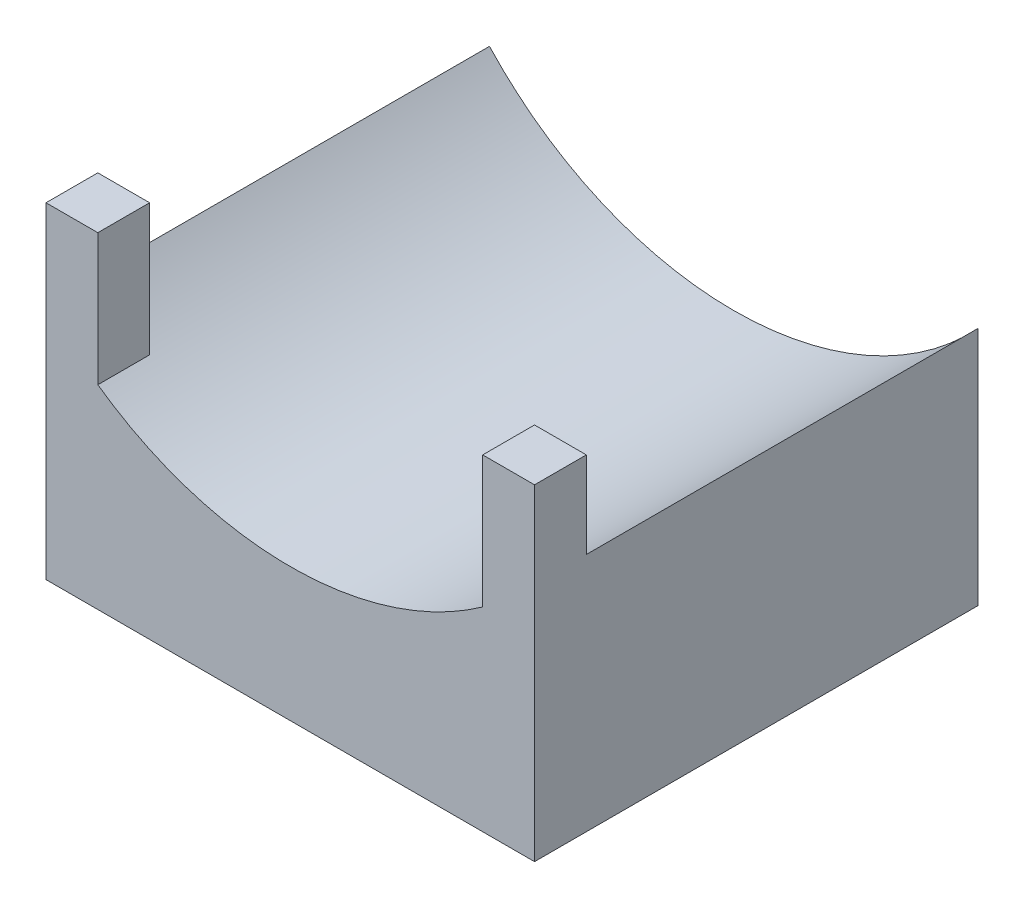
ISO-10303-21;
HEADER;
FILE_DESCRIPTION(('STEP AP214'),'2;1');
FILE_NAME('part.step','',(''),(''),'','','');
FILE_SCHEMA(('AUTOMOTIVE_DESIGN { 1 0 10303 214 1 1 1 1 }'));
ENDSEC;
DATA;
#1=APPLICATION_CONTEXT('core data for automotive mechanical design processes');
#2=APPLICATION_PROTOCOL_DEFINITION('international standard','automotive_design',2000,#1);
#3=PRODUCT_CONTEXT('',#1,'mechanical');
#4=PRODUCT('Part','Part','',(#3));
#5=PRODUCT_RELATED_PRODUCT_CATEGORY('part','',(#4));
#6=PRODUCT_DEFINITION_FORMATION('','',#4);
#7=PRODUCT_DEFINITION_CONTEXT('part definition',#1,'design');
#8=PRODUCT_DEFINITION('design','',#6,#7);
#9=PRODUCT_DEFINITION_SHAPE('','',#8);
#10=(LENGTH_UNIT() NAMED_UNIT(*) SI_UNIT(.MILLI.,.METRE.));
#11=(NAMED_UNIT(*) PLANE_ANGLE_UNIT() SI_UNIT($,.RADIAN.));
#12=(NAMED_UNIT(*) SI_UNIT($,.STERADIAN.) SOLID_ANGLE_UNIT());
#13=UNCERTAINTY_MEASURE_WITH_UNIT(LENGTH_MEASURE(1.E-05),#10,'distance_accuracy_value','');
#14=(GEOMETRIC_REPRESENTATION_CONTEXT(3) GLOBAL_UNCERTAINTY_ASSIGNED_CONTEXT((#13)) GLOBAL_UNIT_ASSIGNED_CONTEXT((#10,
#11,#12)) REPRESENTATION_CONTEXT('',''));
#15=CARTESIAN_POINT('',(0.,0.,0.));
#16=DIRECTION('',(0.,0.,1.));
#17=DIRECTION('',(1.,0.,0.));
#18=AXIS2_PLACEMENT_3D('',#15,#16,#17);
#19=CARTESIAN_POINT('',(-5.8962,-14.2875,13.5875));
#20=DIRECTION('',(-1.,0.,0.));
#21=DIRECTION('',(0.,0.,1.));
#22=AXIS2_PLACEMENT_3D('',#19,#20,#21);
#23=PLANE('',#22);
#24=DIRECTION('',(0.,0.,-1.));
#25=VECTOR('',#24,1.);
#26=CARTESIAN_POINT('',(-5.8962,-8.32314997822339,13.5875));
#27=LINE('',#26,#25);
#28=CARTESIAN_POINT('',(-5.8962,-8.32314997822339,13.5875));
#29=VERTEX_POINT('',#28);
#30=CARTESIAN_POINT('',(-5.8962,-8.32314997822339,12.));
#31=VERTEX_POINT('',#30);
#32=EDGE_CURVE('E186',#29,#31,#27,.T.);
#33=ORIENTED_EDGE('',*,*,#32,.T.);
#34=DIRECTION('',(0.,1.,0.));
#35=VECTOR('',#34,1.);
#36=CARTESIAN_POINT('',(-5.8962,-14.2875,12.));
#37=LINE('',#36,#35);
#38=CARTESIAN_POINT('',(-5.8962,-4.2875,12.));
#39=VERTEX_POINT('',#38);
#40=EDGE_CURVE('E150',#31,#39,#37,.T.);
#41=ORIENTED_EDGE('',*,*,#40,.T.);
#42=DIRECTION('',(0.,0.,-1.));
#43=VECTOR('',#42,1.);
#44=CARTESIAN_POINT('',(-5.8962,-4.2875,13.5875));
#45=LINE('',#44,#43);
#46=CARTESIAN_POINT('',(-5.8962,-4.2875,13.5875));
#47=VERTEX_POINT('',#46);
#48=EDGE_CURVE('E105',#47,#39,#45,.T.);
#49=ORIENTED_EDGE('',*,*,#48,.F.);
#50=DIRECTION('',(0.,1.,0.));
#51=VECTOR('',#50,1.);
#52=CARTESIAN_POINT('',(-5.8962,-14.2875,13.5875));
#53=LINE('',#52,#51);
#54=EDGE_CURVE('E211',#29,#47,#53,.T.);
#55=ORIENTED_EDGE('',*,*,#54,.F.);
#56=EDGE_LOOP('',(#33,#41,#49,#55));
#57=FACE_BOUND('',#56,.T.);
#58=ADVANCED_FACE('F45',(#57),#23,.F.);
#59=CARTESIAN_POINT('',(5.8962,-14.2875,13.5875));
#60=DIRECTION('',(1.,0.,0.));
#61=DIRECTION('',(0.,0.,-1.));
#62=AXIS2_PLACEMENT_3D('',#59,#60,#61);
#63=PLANE('',#62);
#64=DIRECTION('',(0.,0.,-1.));
#65=VECTOR('',#64,1.);
#66=CARTESIAN_POINT('',(5.8962,-8.32314997822339,13.5875));
#67=LINE('',#66,#65);
#68=CARTESIAN_POINT('',(5.8962,-8.32314997822339,13.5875));
#69=VERTEX_POINT('',#68);
#70=CARTESIAN_POINT('',(5.8962,-8.32314997822339,12.));
#71=VERTEX_POINT('',#70);
#72=EDGE_CURVE('E191',#69,#71,#67,.T.);
#73=ORIENTED_EDGE('',*,*,#72,.F.);
#74=DIRECTION('',(0.,-1.,0.));
#75=VECTOR('',#74,1.);
#76=CARTESIAN_POINT('',(5.8962,-14.2875,13.5875));
#77=LINE('',#76,#75);
#78=CARTESIAN_POINT('',(5.8962,-4.2875,13.5875));
#79=VERTEX_POINT('',#78);
#80=EDGE_CURVE('E179',#79,#69,#77,.T.);
#81=ORIENTED_EDGE('',*,*,#80,.F.);
#82=DIRECTION('',(0.,0.,-1.));
#83=VECTOR('',#82,1.);
#84=CARTESIAN_POINT('',(5.8962,-4.2875,13.5875));
#85=LINE('',#84,#83);
#86=CARTESIAN_POINT('',(5.8962,-4.2875,12.));
#87=VERTEX_POINT('',#86);
#88=EDGE_CURVE('E175',#79,#87,#85,.T.);
#89=ORIENTED_EDGE('',*,*,#88,.T.);
#90=DIRECTION('',(0.,-1.,0.));
#91=VECTOR('',#90,1.);
#92=CARTESIAN_POINT('',(5.8962,-14.2875,12.));
#93=LINE('',#92,#91);
#94=EDGE_CURVE('E183',#87,#71,#93,.T.);
#95=ORIENTED_EDGE('',*,*,#94,.T.);
#96=EDGE_LOOP('',(#73,#81,#89,#95));
#97=FACE_BOUND('',#96,.T.);
#98=ADVANCED_FACE('F255',(#97),#63,.F.);
#99=CARTESIAN_POINT('',(0.,0.,12.));
#100=DIRECTION('',(0.,0.,-1.));
#101=DIRECTION('',(-1.,0.,0.));
#102=AXIS2_PLACEMENT_3D('',#99,#100,#101);
#103=CYLINDRICAL_SURFACE('',#102,10.2);
#104=CARTESIAN_POINT('',(0.,0.,0.));
#105=DIRECTION('',(0.,0.,1.));
#106=DIRECTION('',(1.,0.,0.));
#107=AXIS2_PLACEMENT_3D('',#104,#105,#106);
#108=CIRCLE('',#107,10.2);
#109=CARTESIAN_POINT('',(-7.4837,-6.93067343841852,0.));
#110=VERTEX_POINT('',#109);
#111=CARTESIAN_POINT('',(7.4837,-6.93067343841852,0.));
#112=VERTEX_POINT('',#111);
#113=EDGE_CURVE('E86',#110,#112,#108,.T.);
#114=ORIENTED_EDGE('',*,*,#113,.F.);
#115=DIRECTION('',(0.,0.,-1.));
#116=VECTOR('',#115,1.);
#117=CARTESIAN_POINT('',(-7.4837,-6.93067343841852,12.));
#118=LINE('',#117,#116);
#119=CARTESIAN_POINT('',(-7.4837,-6.93067343841852,12.));
#120=VERTEX_POINT('',#119);
#121=EDGE_CURVE('E11',#120,#110,#118,.T.);
#122=ORIENTED_EDGE('',*,*,#121,.F.);
#123=CARTESIAN_POINT('',(0.,0.,12.));
#124=DIRECTION('',(0.,0.,1.));
#125=DIRECTION('',(1.,0.,0.));
#126=AXIS2_PLACEMENT_3D('',#123,#124,#125);
#127=CIRCLE('',#126,10.2);
#128=EDGE_CURVE('E92',#120,#31,#127,.T.);
#129=ORIENTED_EDGE('',*,*,#128,.T.);
#130=ORIENTED_EDGE('',*,*,#32,.F.);
#131=CARTESIAN_POINT('',(0.,0.,13.5875));
#132=DIRECTION('',(0.,0.,-1.));
#133=DIRECTION('',(1.,0.,0.));
#134=AXIS2_PLACEMENT_3D('',#131,#132,#133);
#135=CIRCLE('',#134,10.2);
#136=EDGE_CURVE('E246',#69,#29,#135,.T.);
#137=ORIENTED_EDGE('',*,*,#136,.F.);
#138=ORIENTED_EDGE('',*,*,#72,.T.);
#139=CARTESIAN_POINT('',(7.4837,-6.93067343841852,12.));
#140=VERTEX_POINT('',#139);
#141=EDGE_CURVE('E63',#71,#140,#127,.T.);
#142=ORIENTED_EDGE('',*,*,#141,.T.);
#143=DIRECTION('',(0.,0.,-1.));
#144=VECTOR('',#143,1.);
#145=CARTESIAN_POINT('',(7.4837,-6.93067343841852,12.));
#146=LINE('',#145,#144);
#147=EDGE_CURVE('E83',#140,#112,#146,.T.);
#148=ORIENTED_EDGE('',*,*,#147,.T.);
#149=EDGE_LOOP('',(#114,#122,#129,#130,#137,#138,#142,#148));
#150=FACE_BOUND('',#149,.T.);
#151=ADVANCED_FACE('F47',(#150),#103,.F.);
#152=CARTESIAN_POINT('',(-7.4837,0.,12.));
#153=DIRECTION('',(1.,0.,0.));
#154=DIRECTION('',(0.,1.,0.));
#155=AXIS2_PLACEMENT_3D('',#152,#153,#154);
#156=PLANE('',#155);
#157=DIRECTION('',(0.,-1.,0.));
#158=VECTOR('',#157,1.);
#159=CARTESIAN_POINT('',(-7.4837,0.,0.));
#160=LINE('',#159,#158);
#161=CARTESIAN_POINT('',(-7.4837,-14.2875,0.));
#162=VERTEX_POINT('',#161);
#163=EDGE_CURVE('E103',#110,#162,#160,.T.);
#164=ORIENTED_EDGE('',*,*,#163,.T.);
#165=DIRECTION('',(0.,0.,-1.));
#166=VECTOR('',#165,1.);
#167=CARTESIAN_POINT('',(-7.4837,-14.2875,12.));
#168=LINE('',#167,#166);
#169=CARTESIAN_POINT('',(-7.4837,-14.2875,13.5875));
#170=VERTEX_POINT('',#169);
#171=EDGE_CURVE('E55',#170,#162,#168,.T.);
#172=ORIENTED_EDGE('',*,*,#171,.F.);
#173=DIRECTION('',(0.,-1.,0.));
#174=VECTOR('',#173,1.);
#175=CARTESIAN_POINT('',(-7.4837,-14.2875,13.5875));
#176=LINE('',#175,#174);
#177=CARTESIAN_POINT('',(-7.4837,-4.2875,13.5875));
#178=VERTEX_POINT('',#177);
#179=EDGE_CURVE('E130',#178,#170,#176,.T.);
#180=ORIENTED_EDGE('',*,*,#179,.F.);
#181=DIRECTION('',(0.,0.,-1.));
#182=VECTOR('',#181,1.);
#183=CARTESIAN_POINT('',(-7.4837,-4.2875,13.5875));
#184=LINE('',#183,#182);
#185=CARTESIAN_POINT('',(-7.4837,-4.2875,12.));
#186=VERTEX_POINT('',#185);
#187=EDGE_CURVE('E111',#178,#186,#184,.T.);
#188=ORIENTED_EDGE('',*,*,#187,.T.);
#189=DIRECTION('',(0.,-1.,0.));
#190=VECTOR('',#189,1.);
#191=CARTESIAN_POINT('',(-7.4837,-14.2875,12.));
#192=LINE('',#191,#190);
#193=EDGE_CURVE('E203',#186,#120,#192,.T.);
#194=ORIENTED_EDGE('',*,*,#193,.T.);
#195=ORIENTED_EDGE('',*,*,#121,.T.);
#196=EDGE_LOOP('',(#164,#172,#180,#188,#194,#195));
#197=FACE_BOUND('',#196,.T.);
#198=ADVANCED_FACE('F128',(#197),#156,.F.);
#199=CARTESIAN_POINT('',(0.,-14.2875,12.));
#200=DIRECTION('',(0.,1.,0.));
#201=DIRECTION('',(0.,0.,1.));
#202=AXIS2_PLACEMENT_3D('',#199,#200,#201);
#203=PLANE('',#202);
#204=DIRECTION('',(1.,0.,0.));
#205=VECTOR('',#204,1.);
#206=CARTESIAN_POINT('',(0.,-14.2875,0.));
#207=LINE('',#206,#205);
#208=CARTESIAN_POINT('',(7.4837,-14.2875,0.));
#209=VERTEX_POINT('',#208);
#210=EDGE_CURVE('E80',#162,#209,#207,.T.);
#211=ORIENTED_EDGE('',*,*,#210,.T.);
#212=DIRECTION('',(0.,0.,-1.));
#213=VECTOR('',#212,1.);
#214=CARTESIAN_POINT('',(7.4837,-14.2875,12.));
#215=LINE('',#214,#213);
#216=CARTESIAN_POINT('',(7.4837,-14.2875,13.5875));
#217=VERTEX_POINT('',#216);
#218=EDGE_CURVE('E91',#217,#209,#215,.T.);
#219=ORIENTED_EDGE('',*,*,#218,.F.);
#220=DIRECTION('',(1.,0.,0.));
#221=VECTOR('',#220,1.);
#222=CARTESIAN_POINT('',(-7.4837,-14.2875,13.5875));
#223=LINE('',#222,#221);
#224=EDGE_CURVE('E124',#170,#217,#223,.T.);
#225=ORIENTED_EDGE('',*,*,#224,.F.);
#226=ORIENTED_EDGE('',*,*,#171,.T.);
#227=EDGE_LOOP('',(#211,#219,#225,#226));
#228=FACE_BOUND('',#227,.T.);
#229=ADVANCED_FACE('F121',(#228),#203,.F.);
#230=CARTESIAN_POINT('',(7.4837,0.,12.));
#231=DIRECTION('',(-1.,0.,0.));
#232=DIRECTION('',(0.,-1.,0.));
#233=AXIS2_PLACEMENT_3D('',#230,#231,#232);
#234=PLANE('',#233);
#235=DIRECTION('',(0.,1.,0.));
#236=VECTOR('',#235,1.);
#237=CARTESIAN_POINT('',(7.4837,0.,0.));
#238=LINE('',#237,#236);
#239=EDGE_CURVE('E95',#209,#112,#238,.T.);
#240=ORIENTED_EDGE('',*,*,#239,.T.);
#241=ORIENTED_EDGE('',*,*,#147,.F.);
#242=DIRECTION('',(0.,1.,0.));
#243=VECTOR('',#242,1.);
#244=CARTESIAN_POINT('',(7.4837,-14.2875,12.));
#245=LINE('',#244,#243);
#246=CARTESIAN_POINT('',(7.4837,-4.2875,12.));
#247=VERTEX_POINT('',#246);
#248=EDGE_CURVE('E154',#140,#247,#245,.T.);
#249=ORIENTED_EDGE('',*,*,#248,.T.);
#250=DIRECTION('',(0.,0.,-1.));
#251=VECTOR('',#250,1.);
#252=CARTESIAN_POINT('',(7.4837,-4.2875,13.5875));
#253=LINE('',#252,#251);
#254=CARTESIAN_POINT('',(7.4837,-4.2875,13.5875));
#255=VERTEX_POINT('',#254);
#256=EDGE_CURVE('E173',#255,#247,#253,.T.);
#257=ORIENTED_EDGE('',*,*,#256,.F.);
#258=DIRECTION('',(0.,1.,0.));
#259=VECTOR('',#258,1.);
#260=CARTESIAN_POINT('',(7.4837,-14.2875,13.5875));
#261=LINE('',#260,#259);
#262=EDGE_CURVE('E178',#217,#255,#261,.T.);
#263=ORIENTED_EDGE('',*,*,#262,.F.);
#264=ORIENTED_EDGE('',*,*,#218,.T.);
#265=EDGE_LOOP('',(#240,#241,#249,#257,#263,#264));
#266=FACE_BOUND('',#265,.T.);
#267=ADVANCED_FACE('F96',(#266),#234,.F.);
#268=CARTESIAN_POINT('',(0.,0.,0.));
#269=DIRECTION('',(0.,0.,1.));
#270=DIRECTION('',(1.,0.,0.));
#271=AXIS2_PLACEMENT_3D('',#268,#269,#270);
#272=PLANE('',#271);
#273=ORIENTED_EDGE('',*,*,#113,.T.);
#274=ORIENTED_EDGE('',*,*,#239,.F.);
#275=ORIENTED_EDGE('',*,*,#210,.F.);
#276=ORIENTED_EDGE('',*,*,#163,.F.);
#277=EDGE_LOOP('',(#273,#274,#275,#276));
#278=FACE_BOUND('',#277,.T.);
#279=ADVANCED_FACE('F102',(#278),#272,.F.);
#280=CARTESIAN_POINT('',(0.,0.,12.));
#281=DIRECTION('',(0.,0.,-1.));
#282=DIRECTION('',(-1.,0.,0.));
#283=AXIS2_PLACEMENT_3D('',#280,#281,#282);
#284=PLANE('',#283);
#285=ORIENTED_EDGE('',*,*,#128,.F.);
#286=ORIENTED_EDGE('',*,*,#193,.F.);
#287=DIRECTION('',(-1.,0.,0.));
#288=VECTOR('',#287,1.);
#289=CARTESIAN_POINT('',(-7.4837,-4.2875,12.));
#290=LINE('',#289,#288);
#291=EDGE_CURVE('E208',#39,#186,#290,.T.);
#292=ORIENTED_EDGE('',*,*,#291,.F.);
#293=ORIENTED_EDGE('',*,*,#40,.F.);
#294=EDGE_LOOP('',(#285,#286,#292,#293));
#295=FACE_BOUND('',#294,.T.);
#296=ADVANCED_FACE('F232',(#295),#284,.T.);
#297=CARTESIAN_POINT('',(-7.4837,-4.2875,13.5875));
#298=DIRECTION('',(0.,-1.,0.));
#299=DIRECTION('',(0.,0.,-1.));
#300=AXIS2_PLACEMENT_3D('',#297,#298,#299);
#301=PLANE('',#300);
#302=ORIENTED_EDGE('',*,*,#291,.T.);
#303=ORIENTED_EDGE('',*,*,#187,.F.);
#304=DIRECTION('',(-1.,0.,0.));
#305=VECTOR('',#304,1.);
#306=CARTESIAN_POINT('',(-7.4837,-4.2875,13.5875));
#307=LINE('',#306,#305);
#308=EDGE_CURVE('E214',#47,#178,#307,.T.);
#309=ORIENTED_EDGE('',*,*,#308,.F.);
#310=ORIENTED_EDGE('',*,*,#48,.T.);
#311=EDGE_LOOP('',(#302,#303,#309,#310));
#312=FACE_BOUND('',#311,.T.);
#313=ADVANCED_FACE('F269',(#312),#301,.F.);
#314=CARTESIAN_POINT('',(0.,0.,13.5875));
#315=DIRECTION('',(0.,0.,-1.));
#316=DIRECTION('',(-1.,0.,0.));
#317=AXIS2_PLACEMENT_3D('',#314,#315,#316);
#318=PLANE('',#317);
#319=ORIENTED_EDGE('',*,*,#179,.T.);
#320=ORIENTED_EDGE('',*,*,#224,.T.);
#321=ORIENTED_EDGE('',*,*,#262,.T.);
#322=DIRECTION('',(-1.,0.,0.));
#323=VECTOR('',#322,1.);
#324=CARTESIAN_POINT('',(7.4837,-4.2875,13.5875));
#325=LINE('',#324,#323);
#326=EDGE_CURVE('E168',#255,#79,#325,.T.);
#327=ORIENTED_EDGE('',*,*,#326,.T.);
#328=ORIENTED_EDGE('',*,*,#80,.T.);
#329=ORIENTED_EDGE('',*,*,#136,.T.);
#330=ORIENTED_EDGE('',*,*,#54,.T.);
#331=ORIENTED_EDGE('',*,*,#308,.T.);
#332=EDGE_LOOP('',(#319,#320,#321,#327,#328,#329,#330,#331));
#333=FACE_BOUND('',#332,.T.);
#334=ADVANCED_FACE('F181',(#333),#318,.F.);
#335=CARTESIAN_POINT('',(7.4837,-4.2875,13.5875));
#336=DIRECTION('',(0.,-1.,0.));
#337=DIRECTION('',(0.,0.,-1.));
#338=AXIS2_PLACEMENT_3D('',#335,#336,#337);
#339=PLANE('',#338);
#340=DIRECTION('',(-1.,0.,0.));
#341=VECTOR('',#340,1.);
#342=CARTESIAN_POINT('',(7.4837,-4.2875,12.));
#343=LINE('',#342,#341);
#344=EDGE_CURVE('E198',#247,#87,#343,.T.);
#345=ORIENTED_EDGE('',*,*,#344,.T.);
#346=ORIENTED_EDGE('',*,*,#88,.F.);
#347=ORIENTED_EDGE('',*,*,#326,.F.);
#348=ORIENTED_EDGE('',*,*,#256,.T.);
#349=EDGE_LOOP('',(#345,#346,#347,#348));
#350=FACE_BOUND('',#349,.T.);
#351=ADVANCED_FACE('F172',(#350),#339,.F.);
#352=CARTESIAN_POINT('',(0.,0.,12.));
#353=DIRECTION('',(0.,0.,1.));
#354=DIRECTION('',(1.,0.,0.));
#355=AXIS2_PLACEMENT_3D('',#352,#353,#354);
#356=PLANE('',#355);
#357=ORIENTED_EDGE('',*,*,#141,.F.);
#358=ORIENTED_EDGE('',*,*,#94,.F.);
#359=ORIENTED_EDGE('',*,*,#344,.F.);
#360=ORIENTED_EDGE('',*,*,#248,.F.);
#361=EDGE_LOOP('',(#357,#358,#359,#360));
#362=FACE_BOUND('',#361,.T.);
#363=ADVANCED_FACE('F254',(#362),#356,.F.);
#364=CLOSED_SHELL('',(#58,#98,#151,#198,#229,#267,#279,#296,#313,#334,#351,#363));
#365=MANIFOLD_SOLID_BREP('B2',#364);
#366=ADVANCED_BREP_SHAPE_REPRESENTATION('',(#18,#365),#14);
#367=SHAPE_DEFINITION_REPRESENTATION(#9,#366);
ENDSEC;
END-ISO-10303-21;
